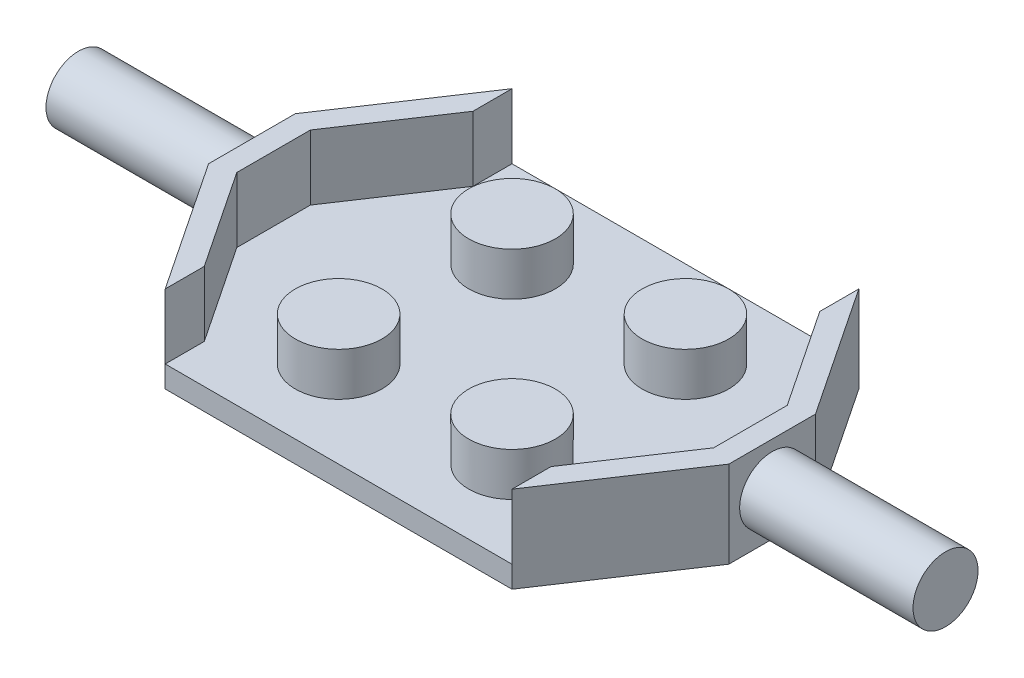
ISO-10303-21;
HEADER;
FILE_DESCRIPTION(('STEP AP214'),'2;1');
FILE_NAME('part.step','',(''),(''),'','','');
FILE_SCHEMA(('AUTOMOTIVE_DESIGN { 1 0 10303 214 1 1 1 1 }'));
ENDSEC;
DATA;
#1=APPLICATION_CONTEXT('core data for automotive mechanical design processes');
#2=APPLICATION_PROTOCOL_DEFINITION('international standard','automotive_design',2000,#1);
#3=PRODUCT_CONTEXT('',#1,'mechanical');
#4=PRODUCT('Part','Part','',(#3));
#5=PRODUCT_RELATED_PRODUCT_CATEGORY('part','',(#4));
#6=PRODUCT_DEFINITION_FORMATION('','',#4);
#7=PRODUCT_DEFINITION_CONTEXT('part definition',#1,'design');
#8=PRODUCT_DEFINITION('design','',#6,#7);
#9=PRODUCT_DEFINITION_SHAPE('','',#8);
#10=(LENGTH_UNIT() NAMED_UNIT(*) SI_UNIT(.MILLI.,.METRE.));
#11=(NAMED_UNIT(*) PLANE_ANGLE_UNIT() SI_UNIT($,.RADIAN.));
#12=(NAMED_UNIT(*) SI_UNIT($,.STERADIAN.) SOLID_ANGLE_UNIT());
#13=UNCERTAINTY_MEASURE_WITH_UNIT(LENGTH_MEASURE(1.E-05),#10,'distance_accuracy_value','');
#14=(GEOMETRIC_REPRESENTATION_CONTEXT(3) GLOBAL_UNCERTAINTY_ASSIGNED_CONTEXT((#13)) GLOBAL_UNIT_ASSIGNED_CONTEXT((#10,
#11,#12)) REPRESENTATION_CONTEXT('',''));
#15=CARTESIAN_POINT('',(0.,0.,0.));
#16=DIRECTION('',(0.,0.,1.));
#17=DIRECTION('',(1.,0.,0.));
#18=AXIS2_PLACEMENT_3D('',#15,#16,#17);
#19=CARTESIAN_POINT('',(0.,1.,0.));
#20=DIRECTION('',(0.,1.,0.));
#21=DIRECTION('',(0.,0.,1.));
#22=AXIS2_PLACEMENT_3D('',#19,#20,#21);
#23=PLANE('',#22);
#24=DIRECTION('',(0.,0.,-1.));
#25=VECTOR('',#24,1.);
#26=CARTESIAN_POINT('',(8.,1.,-8.));
#27=LINE('',#26,#25);
#28=CARTESIAN_POINT('',(8.,1.,-6.19722436226801));
#29=VERTEX_POINT('',#28);
#30=CARTESIAN_POINT('',(8.,1.,-8.));
#31=VERTEX_POINT('',#30);
#32=EDGE_CURVE('E174',#29,#31,#27,.T.);
#33=ORIENTED_EDGE('',*,*,#32,.T.);
#34=DIRECTION('',(-1.,0.,0.));
#35=VECTOR('',#34,1.);
#36=CARTESIAN_POINT('',(-8.,1.,-8.));
#37=LINE('',#36,#35);
#38=CARTESIAN_POINT('',(-8.,1.,-8.));
#39=VERTEX_POINT('',#38);
#40=EDGE_CURVE('E374',#31,#39,#37,.T.);
#41=ORIENTED_EDGE('',*,*,#40,.T.);
#42=DIRECTION('',(0.,0.,-1.));
#43=VECTOR('',#42,1.);
#44=CARTESIAN_POINT('',(-8.,1.,-8.));
#45=LINE('',#44,#43);
#46=CARTESIAN_POINT('',(-8.,1.,-6.19722436226801));
#47=VERTEX_POINT('',#46);
#48=EDGE_CURVE('E289',#47,#39,#45,.T.);
#49=ORIENTED_EDGE('',*,*,#48,.F.);
#50=DIRECTION('',(0.554700196225229,0.,-0.832050294337844));
#51=VECTOR('',#50,1.);
#52=CARTESIAN_POINT('',(-8.,1.,-6.19722436226801));
#53=LINE('',#52,#51);
#54=CARTESIAN_POINT('',(-11.,1.,-1.69722436226801));
#55=VERTEX_POINT('',#54);
#56=EDGE_CURVE('E300',#55,#47,#53,.T.);
#57=ORIENTED_EDGE('',*,*,#56,.F.);
#58=DIRECTION('',(0.,0.,-1.));
#59=VECTOR('',#58,1.);
#60=CARTESIAN_POINT('',(-11.,1.,-1.69722436226801));
#61=LINE('',#60,#59);
#62=CARTESIAN_POINT('',(-11.,1.,1.69722436226801));
#63=VERTEX_POINT('',#62);
#64=EDGE_CURVE('E333',#63,#55,#61,.T.);
#65=ORIENTED_EDGE('',*,*,#64,.F.);
#66=DIRECTION('',(-0.554700196225229,0.,-0.832050294337844));
#67=VECTOR('',#66,1.);
#68=CARTESIAN_POINT('',(-11.,1.,1.69722436226801));
#69=LINE('',#68,#67);
#70=CARTESIAN_POINT('',(-8.,1.,6.19722436226801));
#71=VERTEX_POINT('',#70);
#72=EDGE_CURVE('E330',#71,#63,#69,.T.);
#73=ORIENTED_EDGE('',*,*,#72,.F.);
#74=DIRECTION('',(0.,0.,-1.));
#75=VECTOR('',#74,1.);
#76=CARTESIAN_POINT('',(-8.,1.,6.19722436226801));
#77=LINE('',#76,#75);
#78=CARTESIAN_POINT('',(-8.,1.,8.));
#79=VERTEX_POINT('',#78);
#80=EDGE_CURVE('E327',#79,#71,#77,.T.);
#81=ORIENTED_EDGE('',*,*,#80,.F.);
#82=DIRECTION('',(1.,0.,0.));
#83=VECTOR('',#82,1.);
#84=CARTESIAN_POINT('',(-8.,1.,8.));
#85=LINE('',#84,#83);
#86=CARTESIAN_POINT('',(8.,1.,8.));
#87=VERTEX_POINT('',#86);
#88=EDGE_CURVE('E378',#79,#87,#85,.T.);
#89=ORIENTED_EDGE('',*,*,#88,.T.);
#90=DIRECTION('',(0.,0.,-1.));
#91=VECTOR('',#90,1.);
#92=CARTESIAN_POINT('',(8.,1.,6.19722436226801));
#93=LINE('',#92,#91);
#94=CARTESIAN_POINT('',(8.,1.,6.19722436226801));
#95=VERTEX_POINT('',#94);
#96=EDGE_CURVE('E193',#87,#95,#93,.T.);
#97=ORIENTED_EDGE('',*,*,#96,.T.);
#98=DIRECTION('',(0.554700196225229,0.,-0.832050294337844));
#99=VECTOR('',#98,1.);
#100=CARTESIAN_POINT('',(11.,1.,1.69722436226801));
#101=LINE('',#100,#99);
#102=CARTESIAN_POINT('',(11.,1.,1.69722436226801));
#103=VERTEX_POINT('',#102);
#104=EDGE_CURVE('E232',#95,#103,#101,.T.);
#105=ORIENTED_EDGE('',*,*,#104,.T.);
#106=DIRECTION('',(0.,0.,-1.));
#107=VECTOR('',#106,1.);
#108=CARTESIAN_POINT('',(11.,1.,-1.69722436226801));
#109=LINE('',#108,#107);
#110=CARTESIAN_POINT('',(11.,1.,-1.69722436226801));
#111=VERTEX_POINT('',#110);
#112=EDGE_CURVE('E228',#103,#111,#109,.T.);
#113=ORIENTED_EDGE('',*,*,#112,.T.);
#114=DIRECTION('',(-0.554700196225229,0.,-0.832050294337844));
#115=VECTOR('',#114,1.);
#116=CARTESIAN_POINT('',(8.,1.,-6.19722436226801));
#117=LINE('',#116,#115);
#118=EDGE_CURVE('E224',#111,#29,#117,.T.);
#119=ORIENTED_EDGE('',*,*,#118,.T.);
#120=EDGE_LOOP('',(#33,#41,#49,#57,#65,#73,#81,#89,#97,#105,#113,#119));
#121=FACE_BOUND('',#120,.T.);
#122=CARTESIAN_POINT('',(4.,1.,4.));
#123=DIRECTION('',(0.,1.,0.));
#124=DIRECTION('',(0.,0.,1.));
#125=AXIS2_PLACEMENT_3D('',#122,#123,#124);
#126=CIRCLE('',#125,2.);
#127=CARTESIAN_POINT('',(4.,1.,6.));
#128=VERTEX_POINT('',#127);
#129=EDGE_CURVE('E11',#128,#128,#126,.T.);
#130=ORIENTED_EDGE('',*,*,#129,.F.);
#131=EDGE_LOOP('',(#130));
#132=FACE_BOUND('',#131,.T.);
#133=CARTESIAN_POINT('',(4.,1.,-4.));
#134=DIRECTION('',(0.,1.,0.));
#135=DIRECTION('',(0.,0.,1.));
#136=AXIS2_PLACEMENT_3D('',#133,#134,#135);
#137=CIRCLE('',#136,2.);
#138=CARTESIAN_POINT('',(4.,1.,-2.));
#139=VERTEX_POINT('',#138);
#140=EDGE_CURVE('E48',#139,#139,#137,.T.);
#141=ORIENTED_EDGE('',*,*,#140,.F.);
#142=EDGE_LOOP('',(#141));
#143=FACE_BOUND('',#142,.T.);
#144=CARTESIAN_POINT('',(-4.,1.,4.));
#145=DIRECTION('',(0.,1.,0.));
#146=DIRECTION('',(0.,0.,-1.));
#147=AXIS2_PLACEMENT_3D('',#144,#145,#146);
#148=CIRCLE('',#147,2.);
#149=CARTESIAN_POINT('',(-4.,1.,2.));
#150=VERTEX_POINT('',#149);
#151=EDGE_CURVE('E357',#150,#150,#148,.T.);
#152=ORIENTED_EDGE('',*,*,#151,.F.);
#153=EDGE_LOOP('',(#152));
#154=FACE_BOUND('',#153,.T.);
#155=CARTESIAN_POINT('',(-4.,1.,-4.));
#156=DIRECTION('',(0.,1.,0.));
#157=DIRECTION('',(0.,0.,1.));
#158=AXIS2_PLACEMENT_3D('',#155,#156,#157);
#159=CIRCLE('',#158,2.);
#160=CARTESIAN_POINT('',(-4.,1.,-2.));
#161=VERTEX_POINT('',#160);
#162=EDGE_CURVE('E362',#161,#161,#159,.T.);
#163=ORIENTED_EDGE('',*,*,#162,.F.);
#164=EDGE_LOOP('',(#163));
#165=FACE_BOUND('',#164,.T.);
#166=ADVANCED_FACE('F39',(#121,#132,#143,#154,#165),#23,.T.);
#167=CARTESIAN_POINT('',(-8.,1.,-8.));
#168=DIRECTION('',(0.,0.,1.));
#169=DIRECTION('',(1.,0.,0.));
#170=AXIS2_PLACEMENT_3D('',#167,#168,#169);
#171=PLANE('',#170);
#172=DIRECTION('',(-1.,0.,0.));
#173=VECTOR('',#172,1.);
#174=CARTESIAN_POINT('',(-8.,0.,-8.));
#175=LINE('',#174,#173);
#176=CARTESIAN_POINT('',(8.,0.,-8.));
#177=VERTEX_POINT('',#176);
#178=CARTESIAN_POINT('',(-8.,0.,-8.));
#179=VERTEX_POINT('',#178);
#180=EDGE_CURVE('E370',#177,#179,#175,.T.);
#181=ORIENTED_EDGE('',*,*,#180,.T.);
#182=DIRECTION('',(0.,-1.,0.));
#183=VECTOR('',#182,1.);
#184=CARTESIAN_POINT('',(-8.,1.,-8.));
#185=LINE('',#184,#183);
#186=EDGE_CURVE('E294',#39,#179,#185,.T.);
#187=ORIENTED_EDGE('',*,*,#186,.F.);
#188=ORIENTED_EDGE('',*,*,#40,.F.);
#189=DIRECTION('',(0.,-1.,0.));
#190=VECTOR('',#189,1.);
#191=CARTESIAN_POINT('',(8.,1.,-8.));
#192=LINE('',#191,#190);
#193=EDGE_CURVE('E271',#31,#177,#192,.T.);
#194=ORIENTED_EDGE('',*,*,#193,.T.);
#195=EDGE_LOOP('',(#181,#187,#188,#194));
#196=FACE_BOUND('',#195,.T.);
#197=ADVANCED_FACE('F41',(#196),#171,.F.);
#198=CARTESIAN_POINT('',(-12.,1.,-2.));
#199=DIRECTION('',(0.832050294337844,0.,0.554700196225229));
#200=DIRECTION('',(0.554700196225229,0.,-0.832050294337844));
#201=AXIS2_PLACEMENT_3D('',#198,#199,#200);
#202=PLANE('',#201);
#203=DIRECTION('',(-0.554700196225229,0.,0.832050294337844));
#204=VECTOR('',#203,1.);
#205=CARTESIAN_POINT('',(-12.,0.,-2.));
#206=LINE('',#205,#204);
#207=CARTESIAN_POINT('',(-12.,0.,-2.));
#208=VERTEX_POINT('',#207);
#209=EDGE_CURVE('E386',#179,#208,#206,.T.);
#210=ORIENTED_EDGE('',*,*,#209,.T.);
#211=DIRECTION('',(0.,-1.,0.));
#212=VECTOR('',#211,1.);
#213=CARTESIAN_POINT('',(-12.,1.,-2.));
#214=LINE('',#213,#212);
#215=CARTESIAN_POINT('',(-12.,4.,-2.));
#216=VERTEX_POINT('',#215);
#217=EDGE_CURVE('E401',#216,#208,#214,.T.);
#218=ORIENTED_EDGE('',*,*,#217,.F.);
#219=DIRECTION('',(-0.554700196225229,0.,0.832050294337844));
#220=VECTOR('',#219,1.);
#221=CARTESIAN_POINT('',(-8.,4.,-8.));
#222=LINE('',#221,#220);
#223=CARTESIAN_POINT('',(-8.,4.,-8.));
#224=VERTEX_POINT('',#223);
#225=EDGE_CURVE('E299',#224,#216,#222,.T.);
#226=ORIENTED_EDGE('',*,*,#225,.F.);
#227=DIRECTION('',(0.,-1.,0.));
#228=VECTOR('',#227,1.);
#229=CARTESIAN_POINT('',(-8.,4.,-8.));
#230=LINE('',#229,#228);
#231=EDGE_CURVE('E354',#224,#39,#230,.T.);
#232=ORIENTED_EDGE('',*,*,#231,.T.);
#233=ORIENTED_EDGE('',*,*,#186,.T.);
#234=EDGE_LOOP('',(#210,#218,#226,#232,#233));
#235=FACE_BOUND('',#234,.T.);
#236=ADVANCED_FACE('F448',(#235),#202,.F.);
#237=CARTESIAN_POINT('',(-12.,1.,2.));
#238=DIRECTION('',(1.,0.,0.));
#239=DIRECTION('',(0.,0.,-1.));
#240=AXIS2_PLACEMENT_3D('',#237,#238,#239);
#241=PLANE('',#240);
#242=CARTESIAN_POINT('',(-12.,2.,0.));
#243=DIRECTION('',(-1.,0.,0.));
#244=DIRECTION('',(0.,0.,1.));
#245=AXIS2_PLACEMENT_3D('',#242,#243,#244);
#246=CIRCLE('',#245,1.5);
#247=CARTESIAN_POINT('',(-12.,2.,1.5));
#248=VERTEX_POINT('',#247);
#249=EDGE_CURVE('E290',#248,#248,#246,.T.);
#250=ORIENTED_EDGE('',*,*,#249,.F.);
#251=EDGE_LOOP('',(#250));
#252=FACE_BOUND('',#251,.T.);
#253=DIRECTION('',(0.,0.,1.));
#254=VECTOR('',#253,1.);
#255=CARTESIAN_POINT('',(-12.,0.,2.));
#256=LINE('',#255,#254);
#257=CARTESIAN_POINT('',(-12.,0.,2.));
#258=VERTEX_POINT('',#257);
#259=EDGE_CURVE('E389',#208,#258,#256,.T.);
#260=ORIENTED_EDGE('',*,*,#259,.T.);
#261=DIRECTION('',(0.,-1.,0.));
#262=VECTOR('',#261,1.);
#263=CARTESIAN_POINT('',(-12.,1.,2.));
#264=LINE('',#263,#262);
#265=CARTESIAN_POINT('',(-12.,4.,2.));
#266=VERTEX_POINT('',#265);
#267=EDGE_CURVE('E398',#266,#258,#264,.T.);
#268=ORIENTED_EDGE('',*,*,#267,.F.);
#269=DIRECTION('',(0.,0.,1.));
#270=VECTOR('',#269,1.);
#271=CARTESIAN_POINT('',(-12.,4.,-2.));
#272=LINE('',#271,#270);
#273=EDGE_CURVE('E304',#216,#266,#272,.T.);
#274=ORIENTED_EDGE('',*,*,#273,.F.);
#275=ORIENTED_EDGE('',*,*,#217,.T.);
#276=EDGE_LOOP('',(#260,#268,#274,#275));
#277=FACE_BOUND('',#276,.T.);
#278=ADVANCED_FACE('F446',(#252,#277),#241,.F.);
#279=CARTESIAN_POINT('',(-12.,1.,2.));
#280=DIRECTION('',(0.832050294337844,0.,-0.554700196225229));
#281=DIRECTION('',(-0.554700196225229,0.,-0.832050294337844));
#282=AXIS2_PLACEMENT_3D('',#279,#280,#281);
#283=PLANE('',#282);
#284=DIRECTION('',(0.554700196225229,0.,0.832050294337844));
#285=VECTOR('',#284,1.);
#286=CARTESIAN_POINT('',(-12.,0.,2.));
#287=LINE('',#286,#285);
#288=CARTESIAN_POINT('',(-8.,0.,8.));
#289=VERTEX_POINT('',#288);
#290=EDGE_CURVE('E63',#258,#289,#287,.T.);
#291=ORIENTED_EDGE('',*,*,#290,.T.);
#292=DIRECTION('',(0.,-1.,0.));
#293=VECTOR('',#292,1.);
#294=CARTESIAN_POINT('',(-8.,1.,8.));
#295=LINE('',#294,#293);
#296=EDGE_CURVE('E383',#79,#289,#295,.T.);
#297=ORIENTED_EDGE('',*,*,#296,.F.);
#298=DIRECTION('',(0.,-1.,0.));
#299=VECTOR('',#298,1.);
#300=CARTESIAN_POINT('',(-8.,4.,8.));
#301=LINE('',#300,#299);
#302=CARTESIAN_POINT('',(-8.,4.,8.));
#303=VERTEX_POINT('',#302);
#304=EDGE_CURVE('E351',#303,#79,#301,.T.);
#305=ORIENTED_EDGE('',*,*,#304,.F.);
#306=DIRECTION('',(0.554700196225229,0.,0.832050294337844));
#307=VECTOR('',#306,1.);
#308=CARTESIAN_POINT('',(-12.,4.,2.));
#309=LINE('',#308,#307);
#310=EDGE_CURVE('E308',#266,#303,#309,.T.);
#311=ORIENTED_EDGE('',*,*,#310,.F.);
#312=ORIENTED_EDGE('',*,*,#267,.T.);
#313=EDGE_LOOP('',(#291,#297,#305,#311,#312));
#314=FACE_BOUND('',#313,.T.);
#315=ADVANCED_FACE('F442',(#314),#283,.F.);
#316=CARTESIAN_POINT('',(-8.,1.,8.));
#317=DIRECTION('',(0.,0.,-1.));
#318=DIRECTION('',(-1.,0.,0.));
#319=AXIS2_PLACEMENT_3D('',#316,#317,#318);
#320=PLANE('',#319);
#321=DIRECTION('',(1.,0.,0.));
#322=VECTOR('',#321,1.);
#323=CARTESIAN_POINT('',(-8.,0.,8.));
#324=LINE('',#323,#322);
#325=CARTESIAN_POINT('',(8.,0.,8.));
#326=VERTEX_POINT('',#325);
#327=EDGE_CURVE('E379',#289,#326,#324,.T.);
#328=ORIENTED_EDGE('',*,*,#327,.T.);
#329=DIRECTION('',(0.,-1.,0.));
#330=VECTOR('',#329,1.);
#331=CARTESIAN_POINT('',(8.,1.,8.));
#332=LINE('',#331,#330);
#333=EDGE_CURVE('E281',#87,#326,#332,.T.);
#334=ORIENTED_EDGE('',*,*,#333,.F.);
#335=ORIENTED_EDGE('',*,*,#88,.F.);
#336=ORIENTED_EDGE('',*,*,#296,.T.);
#337=EDGE_LOOP('',(#328,#334,#335,#336));
#338=FACE_BOUND('',#337,.T.);
#339=ADVANCED_FACE('F434',(#338),#320,.F.);
#340=CARTESIAN_POINT('',(0.,0.,0.));
#341=DIRECTION('',(0.,1.,0.));
#342=DIRECTION('',(0.,0.,1.));
#343=AXIS2_PLACEMENT_3D('',#340,#341,#342);
#344=PLANE('',#343);
#345=ORIENTED_EDGE('',*,*,#180,.F.);
#346=DIRECTION('',(0.554700196225229,0.,0.832050294337844));
#347=VECTOR('',#346,1.);
#348=CARTESIAN_POINT('',(12.,0.,-2.));
#349=LINE('',#348,#347);
#350=CARTESIAN_POINT('',(12.,0.,-2.));
#351=VERTEX_POINT('',#350);
#352=EDGE_CURVE('E267',#177,#351,#349,.T.);
#353=ORIENTED_EDGE('',*,*,#352,.T.);
#354=DIRECTION('',(0.,0.,1.));
#355=VECTOR('',#354,1.);
#356=CARTESIAN_POINT('',(12.,0.,2.));
#357=LINE('',#356,#355);
#358=CARTESIAN_POINT('',(12.,0.,2.));
#359=VERTEX_POINT('',#358);
#360=EDGE_CURVE('E263',#351,#359,#357,.T.);
#361=ORIENTED_EDGE('',*,*,#360,.T.);
#362=DIRECTION('',(-0.554700196225229,0.,0.832050294337844));
#363=VECTOR('',#362,1.);
#364=CARTESIAN_POINT('',(12.,0.,2.));
#365=LINE('',#364,#363);
#366=EDGE_CURVE('E259',#359,#326,#365,.T.);
#367=ORIENTED_EDGE('',*,*,#366,.T.);
#368=ORIENTED_EDGE('',*,*,#327,.F.);
#369=ORIENTED_EDGE('',*,*,#290,.F.);
#370=ORIENTED_EDGE('',*,*,#259,.F.);
#371=ORIENTED_EDGE('',*,*,#209,.F.);
#372=EDGE_LOOP('',(#345,#353,#361,#367,#368,#369,#370,#371));
#373=FACE_BOUND('',#372,.T.);
#374=ADVANCED_FACE('F424',(#373),#344,.F.);
#375=CARTESIAN_POINT('',(-4.,3.,-4.));
#376=DIRECTION('',(0.,-1.,0.));
#377=DIRECTION('',(0.,0.,-1.));
#378=AXIS2_PLACEMENT_3D('',#375,#376,#377);
#379=CYLINDRICAL_SURFACE('',#378,2.);
#380=CARTESIAN_POINT('',(-4.,3.,-4.));
#381=DIRECTION('',(0.,1.,0.));
#382=DIRECTION('',(0.,0.,1.));
#383=AXIS2_PLACEMENT_3D('',#380,#381,#382);
#384=CIRCLE('',#383,2.);
#385=CARTESIAN_POINT('',(-4.,3.,-2.));
#386=VERTEX_POINT('',#385);
#387=EDGE_CURVE('E366',#386,#386,#384,.T.);
#388=ORIENTED_EDGE('',*,*,#387,.F.);
#389=EDGE_LOOP('',(#388));
#390=FACE_BOUND('',#389,.T.);
#391=ORIENTED_EDGE('',*,*,#162,.T.);
#392=EDGE_LOOP('',(#391));
#393=FACE_BOUND('',#392,.T.);
#394=ADVANCED_FACE('F421',(#390,#393),#379,.T.);
#395=CARTESIAN_POINT('',(-4.,3.,-4.));
#396=DIRECTION('',(0.,1.,0.));
#397=DIRECTION('',(0.,0.,1.));
#398=AXIS2_PLACEMENT_3D('',#395,#396,#397);
#399=PLANE('',#398);
#400=ORIENTED_EDGE('',*,*,#387,.T.);
#401=EDGE_LOOP('',(#400));
#402=FACE_BOUND('',#401,.T.);
#403=ADVANCED_FACE('F423',(#402),#399,.T.);
#404=CARTESIAN_POINT('',(-4.,3.,4.));
#405=DIRECTION('',(0.,-1.,0.));
#406=DIRECTION('',(0.,0.,-1.));
#407=AXIS2_PLACEMENT_3D('',#404,#405,#406);
#408=CYLINDRICAL_SURFACE('',#407,2.);
#409=CARTESIAN_POINT('',(-4.,3.,4.));
#410=DIRECTION('',(0.,1.,0.));
#411=DIRECTION('',(0.,0.,-1.));
#412=AXIS2_PLACEMENT_3D('',#409,#410,#411);
#413=CIRCLE('',#412,2.);
#414=CARTESIAN_POINT('',(-4.,3.,2.));
#415=VERTEX_POINT('',#414);
#416=EDGE_CURVE('E358',#415,#415,#413,.T.);
#417=ORIENTED_EDGE('',*,*,#416,.F.);
#418=EDGE_LOOP('',(#417));
#419=FACE_BOUND('',#418,.T.);
#420=ORIENTED_EDGE('',*,*,#151,.T.);
#421=EDGE_LOOP('',(#420));
#422=FACE_BOUND('',#421,.T.);
#423=ADVANCED_FACE('F431',(#419,#422),#408,.T.);
#424=CARTESIAN_POINT('',(-4.,3.,4.));
#425=DIRECTION('',(0.,-1.,0.));
#426=DIRECTION('',(0.,0.,-1.));
#427=AXIS2_PLACEMENT_3D('',#424,#425,#426);
#428=PLANE('',#427);
#429=ORIENTED_EDGE('',*,*,#416,.T.);
#430=EDGE_LOOP('',(#429));
#431=FACE_BOUND('',#430,.T.);
#432=ADVANCED_FACE('F567',(#431),#428,.F.);
#433=CARTESIAN_POINT('',(-8.,4.,-8.));
#434=DIRECTION('',(-1.,0.,0.));
#435=DIRECTION('',(0.,0.,1.));
#436=AXIS2_PLACEMENT_3D('',#433,#434,#435);
#437=PLANE('',#436);
#438=ORIENTED_EDGE('',*,*,#48,.T.);
#439=ORIENTED_EDGE('',*,*,#231,.F.);
#440=DIRECTION('',(0.,0.,-1.));
#441=VECTOR('',#440,1.);
#442=CARTESIAN_POINT('',(-8.,4.,-8.));
#443=LINE('',#442,#441);
#444=CARTESIAN_POINT('',(-8.,4.,-6.19722436226801));
#445=VERTEX_POINT('',#444);
#446=EDGE_CURVE('E295',#445,#224,#443,.T.);
#447=ORIENTED_EDGE('',*,*,#446,.F.);
#448=DIRECTION('',(0.,-1.,0.));
#449=VECTOR('',#448,1.);
#450=CARTESIAN_POINT('',(-8.,4.,-6.19722436226801));
#451=LINE('',#450,#449);
#452=EDGE_CURVE('E323',#445,#47,#451,.T.);
#453=ORIENTED_EDGE('',*,*,#452,.T.);
#454=EDGE_LOOP('',(#438,#439,#447,#453));
#455=FACE_BOUND('',#454,.T.);
#456=ADVANCED_FACE('F491',(#455),#437,.F.);
#457=CARTESIAN_POINT('',(-8.,4.,6.19722436226801));
#458=DIRECTION('',(-1.,0.,0.));
#459=DIRECTION('',(0.,0.,1.));
#460=AXIS2_PLACEMENT_3D('',#457,#458,#459);
#461=PLANE('',#460);
#462=ORIENTED_EDGE('',*,*,#80,.T.);
#463=DIRECTION('',(0.,-1.,0.));
#464=VECTOR('',#463,1.);
#465=CARTESIAN_POINT('',(-8.,4.,6.19722436226801));
#466=LINE('',#465,#464);
#467=CARTESIAN_POINT('',(-8.,4.,6.19722436226801));
#468=VERTEX_POINT('',#467);
#469=EDGE_CURVE('E347',#468,#71,#466,.T.);
#470=ORIENTED_EDGE('',*,*,#469,.F.);
#471=DIRECTION('',(0.,0.,-1.));
#472=VECTOR('',#471,1.);
#473=CARTESIAN_POINT('',(-8.,4.,6.19722436226801));
#474=LINE('',#473,#472);
#475=EDGE_CURVE('E311',#303,#468,#474,.T.);
#476=ORIENTED_EDGE('',*,*,#475,.F.);
#477=ORIENTED_EDGE('',*,*,#304,.T.);
#478=EDGE_LOOP('',(#462,#470,#476,#477));
#479=FACE_BOUND('',#478,.T.);
#480=ADVANCED_FACE('F482',(#479),#461,.F.);
#481=CARTESIAN_POINT('',(-11.,4.,1.69722436226801));
#482=DIRECTION('',(-0.832050294337844,0.,0.554700196225229));
#483=DIRECTION('',(0.554700196225229,0.,0.832050294337844));
#484=AXIS2_PLACEMENT_3D('',#481,#482,#483);
#485=PLANE('',#484);
#486=ORIENTED_EDGE('',*,*,#72,.T.);
#487=DIRECTION('',(0.,-1.,0.));
#488=VECTOR('',#487,1.);
#489=CARTESIAN_POINT('',(-11.,4.,1.69722436226801));
#490=LINE('',#489,#488);
#491=CARTESIAN_POINT('',(-11.,4.,1.69722436226801));
#492=VERTEX_POINT('',#491);
#493=EDGE_CURVE('E343',#492,#63,#490,.T.);
#494=ORIENTED_EDGE('',*,*,#493,.F.);
#495=DIRECTION('',(-0.554700196225229,0.,-0.832050294337844));
#496=VECTOR('',#495,1.);
#497=CARTESIAN_POINT('',(-11.,4.,1.69722436226801));
#498=LINE('',#497,#496);
#499=EDGE_CURVE('E314',#468,#492,#498,.T.);
#500=ORIENTED_EDGE('',*,*,#499,.F.);
#501=ORIENTED_EDGE('',*,*,#469,.T.);
#502=EDGE_LOOP('',(#486,#494,#500,#501));
#503=FACE_BOUND('',#502,.T.);
#504=ADVANCED_FACE('F558',(#503),#485,.F.);
#505=CARTESIAN_POINT('',(-11.,4.,-1.69722436226801));
#506=DIRECTION('',(-1.,0.,0.));
#507=DIRECTION('',(0.,0.,1.));
#508=AXIS2_PLACEMENT_3D('',#505,#506,#507);
#509=PLANE('',#508);
#510=ORIENTED_EDGE('',*,*,#64,.T.);
#511=DIRECTION('',(0.,-1.,0.));
#512=VECTOR('',#511,1.);
#513=CARTESIAN_POINT('',(-11.,4.,-1.69722436226801));
#514=LINE('',#513,#512);
#515=CARTESIAN_POINT('',(-11.,4.,-1.69722436226801));
#516=VERTEX_POINT('',#515);
#517=EDGE_CURVE('E55',#516,#55,#514,.T.);
#518=ORIENTED_EDGE('',*,*,#517,.F.);
#519=DIRECTION('',(0.,0.,-1.));
#520=VECTOR('',#519,1.);
#521=CARTESIAN_POINT('',(-11.,4.,-1.69722436226801));
#522=LINE('',#521,#520);
#523=EDGE_CURVE('E317',#492,#516,#522,.T.);
#524=ORIENTED_EDGE('',*,*,#523,.F.);
#525=ORIENTED_EDGE('',*,*,#493,.T.);
#526=EDGE_LOOP('',(#510,#518,#524,#525));
#527=FACE_BOUND('',#526,.T.);
#528=ADVANCED_FACE('F555',(#527),#509,.F.);
#529=CARTESIAN_POINT('',(-8.,4.,-6.19722436226801));
#530=DIRECTION('',(-0.832050294337843,0.,-0.554700196225229));
#531=DIRECTION('',(-0.554700196225229,0.,0.832050294337844));
#532=AXIS2_PLACEMENT_3D('',#529,#530,#531);
#533=PLANE('',#532);
#534=ORIENTED_EDGE('',*,*,#56,.T.);
#535=ORIENTED_EDGE('',*,*,#452,.F.);
#536=DIRECTION('',(0.554700196225229,0.,-0.832050294337844));
#537=VECTOR('',#536,1.);
#538=CARTESIAN_POINT('',(-8.,4.,-6.19722436226801));
#539=LINE('',#538,#537);
#540=EDGE_CURVE('E320',#516,#445,#539,.T.);
#541=ORIENTED_EDGE('',*,*,#540,.F.);
#542=ORIENTED_EDGE('',*,*,#517,.T.);
#543=EDGE_LOOP('',(#534,#535,#541,#542));
#544=FACE_BOUND('',#543,.T.);
#545=ADVANCED_FACE('F552',(#544),#533,.F.);
#546=CARTESIAN_POINT('',(0.,4.,0.));
#547=DIRECTION('',(0.,-1.,0.));
#548=DIRECTION('',(0.,0.,-1.));
#549=AXIS2_PLACEMENT_3D('',#546,#547,#548);
#550=PLANE('',#549);
#551=ORIENTED_EDGE('',*,*,#446,.T.);
#552=ORIENTED_EDGE('',*,*,#225,.T.);
#553=ORIENTED_EDGE('',*,*,#273,.T.);
#554=ORIENTED_EDGE('',*,*,#310,.T.);
#555=ORIENTED_EDGE('',*,*,#475,.T.);
#556=ORIENTED_EDGE('',*,*,#499,.T.);
#557=ORIENTED_EDGE('',*,*,#523,.T.);
#558=ORIENTED_EDGE('',*,*,#540,.T.);
#559=EDGE_LOOP('',(#551,#552,#553,#554,#555,#556,#557,#558));
#560=FACE_BOUND('',#559,.T.);
#561=ADVANCED_FACE('F485',(#560),#550,.F.);
#562=CARTESIAN_POINT('',(-20.,2.,0.));
#563=DIRECTION('',(1.,0.,0.));
#564=DIRECTION('',(0.,0.,-1.));
#565=AXIS2_PLACEMENT_3D('',#562,#563,#564);
#566=CYLINDRICAL_SURFACE('',#565,1.5);
#567=CARTESIAN_POINT('',(-20.,2.,0.));
#568=DIRECTION('',(-1.,0.,0.));
#569=DIRECTION('',(0.,0.,1.));
#570=AXIS2_PLACEMENT_3D('',#567,#568,#569);
#571=CIRCLE('',#570,1.5);
#572=CARTESIAN_POINT('',(-20.,2.,1.5));
#573=VERTEX_POINT('',#572);
#574=EDGE_CURVE('E285',#573,#573,#571,.T.);
#575=ORIENTED_EDGE('',*,*,#574,.F.);
#576=EDGE_LOOP('',(#575));
#577=FACE_BOUND('',#576,.T.);
#578=ORIENTED_EDGE('',*,*,#249,.T.);
#579=EDGE_LOOP('',(#578));
#580=FACE_BOUND('',#579,.T.);
#581=ADVANCED_FACE('F545',(#577,#580),#566,.T.);
#582=CARTESIAN_POINT('',(-20.,2.,0.));
#583=DIRECTION('',(-1.,0.,0.));
#584=DIRECTION('',(0.,0.,1.));
#585=AXIS2_PLACEMENT_3D('',#582,#583,#584);
#586=PLANE('',#585);
#587=ORIENTED_EDGE('',*,*,#574,.T.);
#588=EDGE_LOOP('',(#587));
#589=FACE_BOUND('',#588,.T.);
#590=ADVANCED_FACE('F542',(#589),#586,.T.);
#591=CARTESIAN_POINT('',(12.,1.,2.));
#592=DIRECTION('',(0.832050294337844,0.,0.554700196225229));
#593=DIRECTION('',(0.554700196225229,0.,-0.832050294337844));
#594=AXIS2_PLACEMENT_3D('',#591,#592,#593);
#595=PLANE('',#594);
#596=ORIENTED_EDGE('',*,*,#366,.F.);
#597=DIRECTION('',(0.,-1.,0.));
#598=VECTOR('',#597,1.);
#599=CARTESIAN_POINT('',(12.,1.,2.));
#600=LINE('',#599,#598);
#601=CARTESIAN_POINT('',(12.,4.,2.));
#602=VERTEX_POINT('',#601);
#603=EDGE_CURVE('E278',#602,#359,#600,.T.);
#604=ORIENTED_EDGE('',*,*,#603,.F.);
#605=DIRECTION('',(-0.554700196225229,0.,0.832050294337844));
#606=VECTOR('',#605,1.);
#607=CARTESIAN_POINT('',(12.,4.,2.));
#608=LINE('',#607,#606);
#609=CARTESIAN_POINT('',(8.,4.,8.));
#610=VERTEX_POINT('',#609);
#611=EDGE_CURVE('E211',#602,#610,#608,.T.);
#612=ORIENTED_EDGE('',*,*,#611,.T.);
#613=DIRECTION('',(0.,-1.,0.));
#614=VECTOR('',#613,1.);
#615=CARTESIAN_POINT('',(8.,4.,8.));
#616=LINE('',#615,#614);
#617=EDGE_CURVE('E241',#610,#87,#616,.T.);
#618=ORIENTED_EDGE('',*,*,#617,.T.);
#619=ORIENTED_EDGE('',*,*,#333,.T.);
#620=EDGE_LOOP('',(#596,#604,#612,#618,#619));
#621=FACE_BOUND('',#620,.T.);
#622=ADVANCED_FACE('F466',(#621),#595,.T.);
#623=CARTESIAN_POINT('',(12.,1.,2.));
#624=DIRECTION('',(1.,0.,0.));
#625=DIRECTION('',(0.,0.,-1.));
#626=AXIS2_PLACEMENT_3D('',#623,#624,#625);
#627=PLANE('',#626);
#628=CARTESIAN_POINT('',(12.,2.,0.));
#629=DIRECTION('',(-1.,0.,0.));
#630=DIRECTION('',(0.,0.,1.));
#631=AXIS2_PLACEMENT_3D('',#628,#629,#630);
#632=CIRCLE('',#631,1.5);
#633=CARTESIAN_POINT('',(12.,2.,1.5));
#634=VERTEX_POINT('',#633);
#635=EDGE_CURVE('E706',#634,#634,#632,.T.);
#636=ORIENTED_EDGE('',*,*,#635,.T.);
#637=EDGE_LOOP('',(#636));
#638=FACE_BOUND('',#637,.T.);
#639=ORIENTED_EDGE('',*,*,#360,.F.);
#640=DIRECTION('',(0.,-1.,0.));
#641=VECTOR('',#640,1.);
#642=CARTESIAN_POINT('',(12.,1.,-2.));
#643=LINE('',#642,#641);
#644=CARTESIAN_POINT('',(12.,4.,-2.));
#645=VERTEX_POINT('',#644);
#646=EDGE_CURVE('E275',#645,#351,#643,.T.);
#647=ORIENTED_EDGE('',*,*,#646,.F.);
#648=DIRECTION('',(0.,0.,1.));
#649=VECTOR('',#648,1.);
#650=CARTESIAN_POINT('',(12.,4.,-2.));
#651=LINE('',#650,#649);
#652=EDGE_CURVE('E215',#645,#602,#651,.T.);
#653=ORIENTED_EDGE('',*,*,#652,.T.);
#654=ORIENTED_EDGE('',*,*,#603,.T.);
#655=EDGE_LOOP('',(#639,#647,#653,#654));
#656=FACE_BOUND('',#655,.T.);
#657=ADVANCED_FACE('F501',(#638,#656),#627,.T.);
#658=CARTESIAN_POINT('',(12.,1.,-2.));
#659=DIRECTION('',(0.832050294337844,0.,-0.554700196225229));
#660=DIRECTION('',(-0.554700196225229,0.,-0.832050294337844));
#661=AXIS2_PLACEMENT_3D('',#658,#659,#660);
#662=PLANE('',#661);
#663=ORIENTED_EDGE('',*,*,#352,.F.);
#664=ORIENTED_EDGE('',*,*,#193,.F.);
#665=DIRECTION('',(0.,-1.,0.));
#666=VECTOR('',#665,1.);
#667=CARTESIAN_POINT('',(8.,4.,-8.));
#668=LINE('',#667,#666);
#669=CARTESIAN_POINT('',(8.,4.,-8.));
#670=VERTEX_POINT('',#669);
#671=EDGE_CURVE('E221',#670,#31,#668,.T.);
#672=ORIENTED_EDGE('',*,*,#671,.F.);
#673=DIRECTION('',(0.554700196225229,0.,0.832050294337844));
#674=VECTOR('',#673,1.);
#675=CARTESIAN_POINT('',(8.,4.,-8.));
#676=LINE('',#675,#674);
#677=EDGE_CURVE('E191',#670,#645,#676,.T.);
#678=ORIENTED_EDGE('',*,*,#677,.T.);
#679=ORIENTED_EDGE('',*,*,#646,.T.);
#680=EDGE_LOOP('',(#663,#664,#672,#678,#679));
#681=FACE_BOUND('',#680,.T.);
#682=ADVANCED_FACE('F499',(#681),#662,.T.);
#683=CARTESIAN_POINT('',(4.,3.,-4.));
#684=DIRECTION('',(0.,-1.,0.));
#685=DIRECTION('',(0.,0.,-1.));
#686=AXIS2_PLACEMENT_3D('',#683,#684,#685);
#687=CYLINDRICAL_SURFACE('',#686,2.);
#688=CARTESIAN_POINT('',(4.,3.,-4.));
#689=DIRECTION('',(0.,-1.,0.));
#690=DIRECTION('',(0.,0.,1.));
#691=AXIS2_PLACEMENT_3D('',#688,#689,#690);
#692=CIRCLE('',#691,2.);
#693=CARTESIAN_POINT('',(4.,3.,-2.));
#694=VERTEX_POINT('',#693);
#695=EDGE_CURVE('E255',#694,#694,#692,.T.);
#696=ORIENTED_EDGE('',*,*,#695,.T.);
#697=EDGE_LOOP('',(#696));
#698=FACE_BOUND('',#697,.T.);
#699=ORIENTED_EDGE('',*,*,#140,.T.);
#700=EDGE_LOOP('',(#699));
#701=FACE_BOUND('',#700,.T.);
#702=ADVANCED_FACE('F411',(#698,#701),#687,.T.);
#703=CARTESIAN_POINT('',(4.,3.,-4.));
#704=DIRECTION('',(0.,1.,0.));
#705=DIRECTION('',(0.,0.,1.));
#706=AXIS2_PLACEMENT_3D('',#703,#704,#705);
#707=PLANE('',#706);
#708=ORIENTED_EDGE('',*,*,#695,.F.);
#709=EDGE_LOOP('',(#708));
#710=FACE_BOUND('',#709,.T.);
#711=ADVANCED_FACE('F527',(#710),#707,.T.);
#712=CARTESIAN_POINT('',(4.,3.,4.));
#713=DIRECTION('',(0.,-1.,0.));
#714=DIRECTION('',(0.,0.,-1.));
#715=AXIS2_PLACEMENT_3D('',#712,#713,#714);
#716=CYLINDRICAL_SURFACE('',#715,2.);
#717=CARTESIAN_POINT('',(4.,3.,4.));
#718=DIRECTION('',(0.,-1.,0.));
#719=DIRECTION('',(0.,0.,-1.));
#720=AXIS2_PLACEMENT_3D('',#717,#718,#719);
#721=CIRCLE('',#720,2.);
#722=CARTESIAN_POINT('',(4.,3.,2.));
#723=VERTEX_POINT('',#722);
#724=EDGE_CURVE('E180',#723,#723,#721,.T.);
#725=ORIENTED_EDGE('',*,*,#724,.T.);
#726=EDGE_LOOP('',(#725));
#727=FACE_BOUND('',#726,.T.);
#728=ORIENTED_EDGE('',*,*,#129,.T.);
#729=EDGE_LOOP('',(#728));
#730=FACE_BOUND('',#729,.T.);
#731=ADVANCED_FACE('F523',(#727,#730),#716,.T.);
#732=CARTESIAN_POINT('',(4.,3.,4.));
#733=DIRECTION('',(0.,-1.,0.));
#734=DIRECTION('',(0.,0.,-1.));
#735=AXIS2_PLACEMENT_3D('',#732,#733,#734);
#736=PLANE('',#735);
#737=ORIENTED_EDGE('',*,*,#724,.F.);
#738=EDGE_LOOP('',(#737));
#739=FACE_BOUND('',#738,.T.);
#740=ADVANCED_FACE('F520',(#739),#736,.F.);
#741=CARTESIAN_POINT('',(8.,4.,-8.));
#742=DIRECTION('',(-1.,0.,0.));
#743=DIRECTION('',(0.,0.,1.));
#744=AXIS2_PLACEMENT_3D('',#741,#742,#743);
#745=PLANE('',#744);
#746=ORIENTED_EDGE('',*,*,#32,.F.);
#747=DIRECTION('',(0.,-1.,0.));
#748=VECTOR('',#747,1.);
#749=CARTESIAN_POINT('',(8.,4.,-6.19722436226801));
#750=LINE('',#749,#748);
#751=CARTESIAN_POINT('',(8.,4.,-6.19722436226801));
#752=VERTEX_POINT('',#751);
#753=EDGE_CURVE('E168',#752,#29,#750,.T.);
#754=ORIENTED_EDGE('',*,*,#753,.F.);
#755=DIRECTION('',(0.,0.,-1.));
#756=VECTOR('',#755,1.);
#757=CARTESIAN_POINT('',(8.,4.,-8.));
#758=LINE('',#757,#756);
#759=EDGE_CURVE('E171',#752,#670,#758,.T.);
#760=ORIENTED_EDGE('',*,*,#759,.T.);
#761=ORIENTED_EDGE('',*,*,#671,.T.);
#762=EDGE_LOOP('',(#746,#754,#760,#761));
#763=FACE_BOUND('',#762,.T.);
#764=ADVANCED_FACE('F170',(#763),#745,.T.);
#765=CARTESIAN_POINT('',(8.,4.,-6.19722436226801));
#766=DIRECTION('',(-0.832050294337843,0.,0.554700196225229));
#767=DIRECTION('',(0.554700196225229,0.,0.832050294337844));
#768=AXIS2_PLACEMENT_3D('',#765,#766,#767);
#769=PLANE('',#768);
#770=ORIENTED_EDGE('',*,*,#118,.F.);
#771=DIRECTION('',(0.,-1.,0.));
#772=VECTOR('',#771,1.);
#773=CARTESIAN_POINT('',(11.,4.,-1.69722436226801));
#774=LINE('',#773,#772);
#775=CARTESIAN_POINT('',(11.,4.,-1.69722436226801));
#776=VERTEX_POINT('',#775);
#777=EDGE_CURVE('E181',#776,#111,#774,.T.);
#778=ORIENTED_EDGE('',*,*,#777,.F.);
#779=DIRECTION('',(-0.554700196225229,0.,-0.832050294337844));
#780=VECTOR('',#779,1.);
#781=CARTESIAN_POINT('',(8.,4.,-6.19722436226801));
#782=LINE('',#781,#780);
#783=EDGE_CURVE('E187',#776,#752,#782,.T.);
#784=ORIENTED_EDGE('',*,*,#783,.T.);
#785=ORIENTED_EDGE('',*,*,#753,.T.);
#786=EDGE_LOOP('',(#770,#778,#784,#785));
#787=FACE_BOUND('',#786,.T.);
#788=ADVANCED_FACE('F195',(#787),#769,.T.);
#789=CARTESIAN_POINT('',(11.,4.,-1.69722436226801));
#790=DIRECTION('',(-1.,0.,0.));
#791=DIRECTION('',(0.,0.,1.));
#792=AXIS2_PLACEMENT_3D('',#789,#790,#791);
#793=PLANE('',#792);
#794=ORIENTED_EDGE('',*,*,#112,.F.);
#795=DIRECTION('',(0.,-1.,0.));
#796=VECTOR('',#795,1.);
#797=CARTESIAN_POINT('',(11.,4.,1.69722436226801));
#798=LINE('',#797,#796);
#799=CARTESIAN_POINT('',(11.,4.,1.69722436226801));
#800=VERTEX_POINT('',#799);
#801=EDGE_CURVE('E247',#800,#103,#798,.T.);
#802=ORIENTED_EDGE('',*,*,#801,.F.);
#803=DIRECTION('',(0.,0.,-1.));
#804=VECTOR('',#803,1.);
#805=CARTESIAN_POINT('',(11.,4.,-1.69722436226801));
#806=LINE('',#805,#804);
#807=EDGE_CURVE('E197',#800,#776,#806,.T.);
#808=ORIENTED_EDGE('',*,*,#807,.T.);
#809=ORIENTED_EDGE('',*,*,#777,.T.);
#810=EDGE_LOOP('',(#794,#802,#808,#809));
#811=FACE_BOUND('',#810,.T.);
#812=ADVANCED_FACE('F507',(#811),#793,.T.);
#813=CARTESIAN_POINT('',(11.,4.,1.69722436226801));
#814=DIRECTION('',(-0.832050294337844,0.,-0.554700196225229));
#815=DIRECTION('',(-0.554700196225229,0.,0.832050294337844));
#816=AXIS2_PLACEMENT_3D('',#813,#814,#815);
#817=PLANE('',#816);
#818=ORIENTED_EDGE('',*,*,#104,.F.);
#819=DIRECTION('',(0.,-1.,0.));
#820=VECTOR('',#819,1.);
#821=CARTESIAN_POINT('',(8.,4.,6.19722436226801));
#822=LINE('',#821,#820);
#823=CARTESIAN_POINT('',(8.,4.,6.19722436226801));
#824=VERTEX_POINT('',#823);
#825=EDGE_CURVE('E244',#824,#95,#822,.T.);
#826=ORIENTED_EDGE('',*,*,#825,.F.);
#827=DIRECTION('',(0.554700196225229,0.,-0.832050294337844));
#828=VECTOR('',#827,1.);
#829=CARTESIAN_POINT('',(11.,4.,1.69722436226801));
#830=LINE('',#829,#828);
#831=EDGE_CURVE('E200',#824,#800,#830,.T.);
#832=ORIENTED_EDGE('',*,*,#831,.T.);
#833=ORIENTED_EDGE('',*,*,#801,.T.);
#834=EDGE_LOOP('',(#818,#826,#832,#833));
#835=FACE_BOUND('',#834,.T.);
#836=ADVANCED_FACE('F504',(#835),#817,.T.);
#837=CARTESIAN_POINT('',(8.,4.,6.19722436226801));
#838=DIRECTION('',(-1.,0.,0.));
#839=DIRECTION('',(0.,0.,1.));
#840=AXIS2_PLACEMENT_3D('',#837,#838,#839);
#841=PLANE('',#840);
#842=ORIENTED_EDGE('',*,*,#96,.F.);
#843=ORIENTED_EDGE('',*,*,#617,.F.);
#844=DIRECTION('',(0.,0.,-1.));
#845=VECTOR('',#844,1.);
#846=CARTESIAN_POINT('',(8.,4.,6.19722436226801));
#847=LINE('',#846,#845);
#848=EDGE_CURVE('E207',#610,#824,#847,.T.);
#849=ORIENTED_EDGE('',*,*,#848,.T.);
#850=ORIENTED_EDGE('',*,*,#825,.T.);
#851=EDGE_LOOP('',(#842,#843,#849,#850));
#852=FACE_BOUND('',#851,.T.);
#853=ADVANCED_FACE('F471',(#852),#841,.T.);
#854=CARTESIAN_POINT('',(0.,4.,0.));
#855=DIRECTION('',(0.,-1.,0.));
#856=DIRECTION('',(0.,0.,-1.));
#857=AXIS2_PLACEMENT_3D('',#854,#855,#856);
#858=PLANE('',#857);
#859=ORIENTED_EDGE('',*,*,#759,.F.);
#860=ORIENTED_EDGE('',*,*,#783,.F.);
#861=ORIENTED_EDGE('',*,*,#807,.F.);
#862=ORIENTED_EDGE('',*,*,#831,.F.);
#863=ORIENTED_EDGE('',*,*,#848,.F.);
#864=ORIENTED_EDGE('',*,*,#611,.F.);
#865=ORIENTED_EDGE('',*,*,#652,.F.);
#866=ORIENTED_EDGE('',*,*,#677,.F.);
#867=EDGE_LOOP('',(#859,#860,#861,#862,#863,#864,#865,#866));
#868=FACE_BOUND('',#867,.T.);
#869=ADVANCED_FACE('F185',(#868),#858,.F.);
#870=CARTESIAN_POINT('',(20.,2.,0.));
#871=DIRECTION('',(-1.,0.,0.));
#872=DIRECTION('',(0.,0.,1.));
#873=AXIS2_PLACEMENT_3D('',#870,#871,#872);
#874=CYLINDRICAL_SURFACE('',#873,1.5);
#875=CARTESIAN_POINT('',(20.,2.,0.));
#876=DIRECTION('',(-1.,0.,0.));
#877=DIRECTION('',(0.,0.,1.));
#878=AXIS2_PLACEMENT_3D('',#875,#876,#877);
#879=CIRCLE('',#878,1.5);
#880=CARTESIAN_POINT('',(20.,2.,1.5));
#881=VERTEX_POINT('',#880);
#882=EDGE_CURVE('E225',#881,#881,#879,.T.);
#883=ORIENTED_EDGE('',*,*,#882,.T.);
#884=EDGE_LOOP('',(#883));
#885=FACE_BOUND('',#884,.T.);
#886=ORIENTED_EDGE('',*,*,#635,.F.);
#887=EDGE_LOOP('',(#886));
#888=FACE_BOUND('',#887,.T.);
#889=ADVANCED_FACE('F680',(#885,#888),#874,.T.);
#890=CARTESIAN_POINT('',(20.,2.,0.));
#891=DIRECTION('',(1.,0.,0.));
#892=DIRECTION('',(0.,0.,1.));
#893=AXIS2_PLACEMENT_3D('',#890,#891,#892);
#894=PLANE('',#893);
#895=ORIENTED_EDGE('',*,*,#882,.F.);
#896=EDGE_LOOP('',(#895));
#897=FACE_BOUND('',#896,.T.);
#898=ADVANCED_FACE('F689',(#897),#894,.T.);
#899=CLOSED_SHELL('',(#166,#197,#236,#278,#315,#339,#374,#394,#403,#423,#432,#456,#480,#504,
#528,#545,#561,#581,#590,#622,#657,#682,#702,#711,#731,#740,#764,#788,#812,#836,#853,#869,#889,#898));
#900=MANIFOLD_SOLID_BREP('B2',#899);
#901=ADVANCED_BREP_SHAPE_REPRESENTATION('',(#18,#900),#14);
#902=SHAPE_DEFINITION_REPRESENTATION(#9,#901);
ENDSEC;
END-ISO-10303-21;
